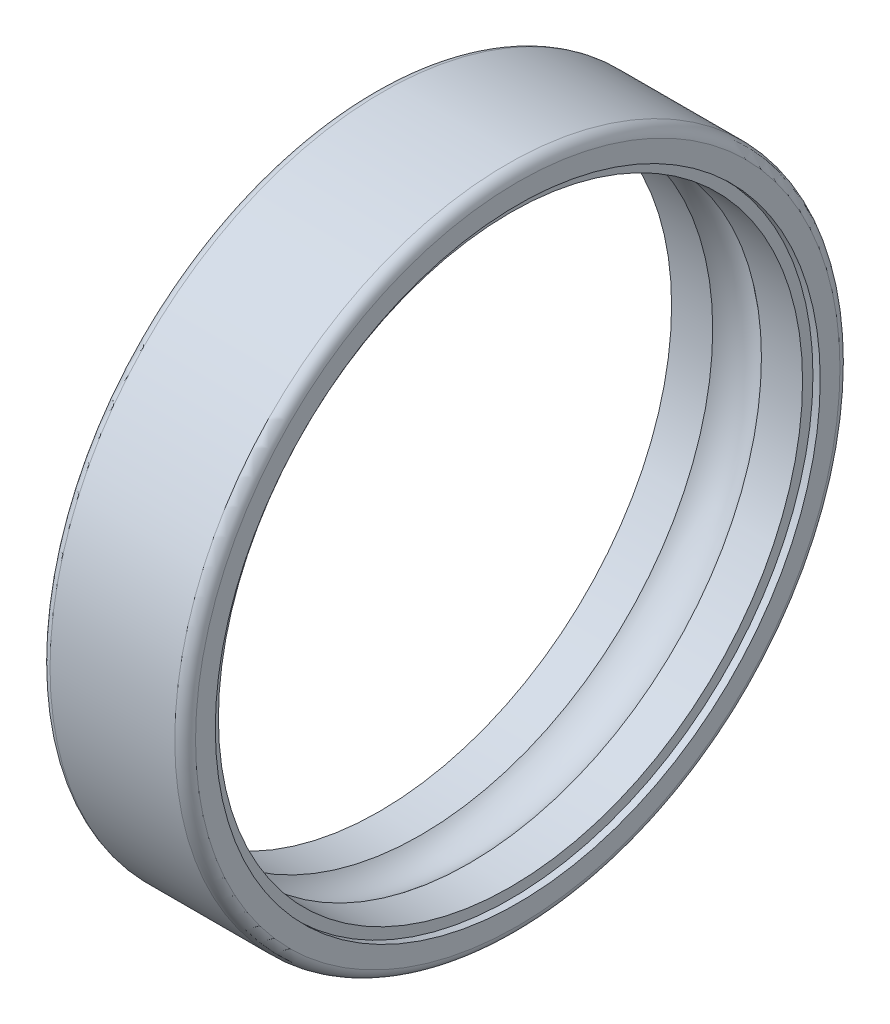
ISO-10303-21;
HEADER;
FILE_DESCRIPTION(('STEP AP214'),'2;1');
FILE_NAME('part.step','',(''),(''),'','','');
FILE_SCHEMA(('AUTOMOTIVE_DESIGN { 1 0 10303 214 1 1 1 1 }'));
ENDSEC;
DATA;
#1=APPLICATION_CONTEXT('core data for automotive mechanical design processes');
#2=APPLICATION_PROTOCOL_DEFINITION('international standard','automotive_design',2000,#1);
#3=PRODUCT_CONTEXT('',#1,'mechanical');
#4=PRODUCT('Part','Part','',(#3));
#5=PRODUCT_RELATED_PRODUCT_CATEGORY('part','',(#4));
#6=PRODUCT_DEFINITION_FORMATION('','',#4);
#7=PRODUCT_DEFINITION_CONTEXT('part definition',#1,'design');
#8=PRODUCT_DEFINITION('design','',#6,#7);
#9=PRODUCT_DEFINITION_SHAPE('','',#8);
#10=(LENGTH_UNIT() NAMED_UNIT(*) SI_UNIT(.MILLI.,.METRE.));
#11=(NAMED_UNIT(*) PLANE_ANGLE_UNIT() SI_UNIT($,.RADIAN.));
#12=(NAMED_UNIT(*) SI_UNIT($,.STERADIAN.) SOLID_ANGLE_UNIT());
#13=UNCERTAINTY_MEASURE_WITH_UNIT(LENGTH_MEASURE(1.E-05),#10,'distance_accuracy_value','');
#14=(GEOMETRIC_REPRESENTATION_CONTEXT(3) GLOBAL_UNCERTAINTY_ASSIGNED_CONTEXT((#13)) GLOBAL_UNIT_ASSIGNED_CONTEXT((#10,
#11,#12)) REPRESENTATION_CONTEXT('',''));
#15=CARTESIAN_POINT('',(0.,0.,0.));
#16=DIRECTION('',(0.,0.,1.));
#17=DIRECTION('',(1.,0.,0.));
#18=AXIS2_PLACEMENT_3D('',#15,#16,#17);
#19=CARTESIAN_POINT('',(0.592782730020049,0.,0.));
#20=DIRECTION('',(1.,0.,0.));
#21=DIRECTION('',(0.,0.,-1.));
#22=AXIS2_PLACEMENT_3D('',#19,#20,#21);
#23=TOROIDAL_SURFACE('',#22,15.4072172699799,0.6);
#24=CARTESIAN_POINT('',(0.500000000000006,0.,0.));
#25=DIRECTION('',(1.,0.,0.));
#26=DIRECTION('',(0.,0.,-1.));
#27=AXIS2_PLACEMENT_3D('',#24,#25,#26);
#28=CIRCLE('',#27,16.);
#29=CARTESIAN_POINT('',(0.500000000000006,0.,-16.));
#30=VERTEX_POINT('',#29);
#31=EDGE_CURVE('E10',#30,#30,#28,.T.);
#32=ORIENTED_EDGE('',*,*,#31,.F.);
#33=EDGE_LOOP('',(#32));
#34=FACE_BOUND('',#33,.T.);
#35=CARTESIAN_POINT('',(0.,0.,0.));
#36=DIRECTION('',(1.,0.,0.));
#37=DIRECTION('',(0.,0.,-1.));
#38=AXIS2_PLACEMENT_3D('',#35,#36,#37);
#39=CIRCLE('',#38,15.5);
#40=CARTESIAN_POINT('',(0.,0.,-15.5));
#41=VERTEX_POINT('',#40);
#42=EDGE_CURVE('E45',#41,#41,#39,.T.);
#43=ORIENTED_EDGE('',*,*,#42,.T.);
#44=EDGE_LOOP('',(#43));
#45=FACE_BOUND('',#44,.T.);
#46=ADVANCED_FACE('F14',(#34,#45),#23,.T.);
#47=CARTESIAN_POINT('',(7.,0.,0.));
#48=DIRECTION('',(1.,0.,0.));
#49=DIRECTION('',(0.,0.,-1.));
#50=AXIS2_PLACEMENT_3D('',#47,#48,#49);
#51=CYLINDRICAL_SURFACE('',#50,16.);
#52=CARTESIAN_POINT('',(6.5,0.,0.));
#53=DIRECTION('',(1.,0.,0.));
#54=DIRECTION('',(0.,0.,-1.));
#55=AXIS2_PLACEMENT_3D('',#52,#53,#54);
#56=CIRCLE('',#55,16.);
#57=CARTESIAN_POINT('',(6.5,0.,-16.));
#58=VERTEX_POINT('',#57);
#59=EDGE_CURVE('E21',#58,#58,#56,.T.);
#60=ORIENTED_EDGE('',*,*,#59,.F.);
#61=EDGE_LOOP('',(#60));
#62=FACE_BOUND('',#61,.T.);
#63=ORIENTED_EDGE('',*,*,#31,.T.);
#64=EDGE_LOOP('',(#63));
#65=FACE_BOUND('',#64,.T.);
#66=ADVANCED_FACE('F83',(#62,#65),#51,.T.);
#67=CARTESIAN_POINT('',(6.40721726997996,0.,0.));
#68=DIRECTION('',(1.,0.,0.));
#69=DIRECTION('',(0.,0.,-1.));
#70=AXIS2_PLACEMENT_3D('',#67,#68,#69);
#71=TOROIDAL_SURFACE('',#70,15.40721726998,0.599999999999991);
#72=CARTESIAN_POINT('',(7.,0.,0.));
#73=DIRECTION('',(1.,0.,0.));
#74=DIRECTION('',(0.,0.,-1.));
#75=AXIS2_PLACEMENT_3D('',#72,#73,#74);
#76=CIRCLE('',#75,15.5);
#77=CARTESIAN_POINT('',(7.,0.,-15.5));
#78=VERTEX_POINT('',#77);
#79=EDGE_CURVE('E28',#78,#78,#76,.T.);
#80=ORIENTED_EDGE('',*,*,#79,.F.);
#81=EDGE_LOOP('',(#80));
#82=FACE_BOUND('',#81,.T.);
#83=ORIENTED_EDGE('',*,*,#59,.T.);
#84=EDGE_LOOP('',(#83));
#85=FACE_BOUND('',#84,.T.);
#86=ADVANCED_FACE('F79',(#82,#85),#71,.T.);
#87=CARTESIAN_POINT('',(7.,14.55,0.));
#88=DIRECTION('',(1.,0.,0.));
#89=DIRECTION('',(0.,1.,0.));
#90=AXIS2_PLACEMENT_3D('',#87,#88,#89);
#91=PLANE('',#90);
#92=CARTESIAN_POINT('',(7.,0.,0.));
#93=DIRECTION('',(1.,0.,0.));
#94=DIRECTION('',(0.,0.,-1.));
#95=AXIS2_PLACEMENT_3D('',#92,#93,#94);
#96=CIRCLE('',#95,14.55);
#97=CARTESIAN_POINT('',(7.,0.,-14.55));
#98=VERTEX_POINT('',#97);
#99=EDGE_CURVE('E40',#98,#98,#96,.T.);
#100=ORIENTED_EDGE('',*,*,#99,.F.);
#101=EDGE_LOOP('',(#100));
#102=FACE_BOUND('',#101,.T.);
#103=ORIENTED_EDGE('',*,*,#79,.T.);
#104=EDGE_LOOP('',(#103));
#105=FACE_BOUND('',#104,.T.);
#106=ADVANCED_FACE('F80',(#102,#105),#91,.T.);
#107=CARTESIAN_POINT('',(7.,0.,0.));
#108=DIRECTION('',(1.,0.,0.));
#109=DIRECTION('',(0.,0.,-1.));
#110=AXIS2_PLACEMENT_3D('',#107,#108,#109);
#111=CYLINDRICAL_SURFACE('',#110,14.55);
#112=CARTESIAN_POINT('',(6.65,0.,0.));
#113=DIRECTION('',(1.,0.,0.));
#114=DIRECTION('',(0.,0.,-1.));
#115=AXIS2_PLACEMENT_3D('',#112,#113,#114);
#116=CIRCLE('',#115,14.55);
#117=CARTESIAN_POINT('',(6.65,0.,-14.55));
#118=VERTEX_POINT('',#117);
#119=EDGE_CURVE('E68',#118,#118,#116,.T.);
#120=ORIENTED_EDGE('',*,*,#119,.F.);
#121=EDGE_LOOP('',(#120));
#122=FACE_BOUND('',#121,.T.);
#123=ORIENTED_EDGE('',*,*,#99,.T.);
#124=EDGE_LOOP('',(#123));
#125=FACE_BOUND('',#124,.T.);
#126=ADVANCED_FACE('F74',(#122,#125),#111,.F.);
#127=CARTESIAN_POINT('',(6.65,14.05,0.));
#128=DIRECTION('',(1.,0.,0.));
#129=DIRECTION('',(0.,1.,0.));
#130=AXIS2_PLACEMENT_3D('',#127,#128,#129);
#131=PLANE('',#130);
#132=CARTESIAN_POINT('',(6.65,0.,0.));
#133=DIRECTION('',(1.,0.,0.));
#134=DIRECTION('',(0.,0.,-1.));
#135=AXIS2_PLACEMENT_3D('',#132,#133,#134);
#136=CIRCLE('',#135,14.05);
#137=CARTESIAN_POINT('',(6.65,0.,-14.05));
#138=VERTEX_POINT('',#137);
#139=EDGE_CURVE('E62',#138,#138,#136,.T.);
#140=ORIENTED_EDGE('',*,*,#139,.F.);
#141=EDGE_LOOP('',(#140));
#142=FACE_BOUND('',#141,.T.);
#143=ORIENTED_EDGE('',*,*,#119,.T.);
#144=EDGE_LOOP('',(#143));
#145=FACE_BOUND('',#144,.T.);
#146=ADVANCED_FACE('F135',(#142,#145),#131,.T.);
#147=CARTESIAN_POINT('',(7.,0.,0.));
#148=DIRECTION('',(1.,0.,0.));
#149=DIRECTION('',(0.,0.,-1.));
#150=AXIS2_PLACEMENT_3D('',#147,#148,#149);
#151=CYLINDRICAL_SURFACE('',#150,14.05);
#152=CARTESIAN_POINT('',(4.671537451386,0.,0.));
#153=DIRECTION('',(1.,0.,0.));
#154=DIRECTION('',(0.,0.,-1.));
#155=AXIS2_PLACEMENT_3D('',#152,#153,#154);
#156=CIRCLE('',#155,14.05);
#157=CARTESIAN_POINT('',(4.671537451386,0.,-14.05));
#158=VERTEX_POINT('',#157);
#159=EDGE_CURVE('E59',#158,#158,#156,.T.);
#160=ORIENTED_EDGE('',*,*,#159,.F.);
#161=EDGE_LOOP('',(#160));
#162=FACE_BOUND('',#161,.T.);
#163=ORIENTED_EDGE('',*,*,#139,.T.);
#164=EDGE_LOOP('',(#163));
#165=FACE_BOUND('',#164,.T.);
#166=ADVANCED_FACE('F130',(#162,#165),#151,.F.);
#167=CARTESIAN_POINT('',(3.5,0.,0.));
#168=DIRECTION('',(1.,0.,0.));
#169=DIRECTION('',(0.,0.,-1.));
#170=AXIS2_PLACEMENT_3D('',#167,#168,#169);
#171=TOROIDAL_SURFACE('',#170,12.75,1.75);
#172=ORIENTED_EDGE('',*,*,#159,.T.);
#173=EDGE_LOOP('',(#172));
#174=FACE_BOUND('',#173,.T.);
#175=CARTESIAN_POINT('',(2.328462548614,0.,0.));
#176=DIRECTION('',(1.,0.,0.));
#177=DIRECTION('',(0.,0.,-1.));
#178=AXIS2_PLACEMENT_3D('',#175,#176,#177);
#179=CIRCLE('',#178,14.05);
#180=CARTESIAN_POINT('',(2.328462548614,0.,-14.05));
#181=VERTEX_POINT('',#180);
#182=EDGE_CURVE('E50',#181,#181,#179,.T.);
#183=ORIENTED_EDGE('',*,*,#182,.F.);
#184=EDGE_LOOP('',(#183));
#185=FACE_BOUND('',#184,.T.);
#186=ADVANCED_FACE('F123',(#174,#185),#171,.F.);
#187=CARTESIAN_POINT('',(7.,0.,0.));
#188=DIRECTION('',(1.,0.,0.));
#189=DIRECTION('',(0.,0.,-1.));
#190=AXIS2_PLACEMENT_3D('',#187,#188,#189);
#191=CYLINDRICAL_SURFACE('',#190,14.05);
#192=CARTESIAN_POINT('',(0.35,0.,0.));
#193=DIRECTION('',(1.,0.,0.));
#194=DIRECTION('',(0.,0.,-1.));
#195=AXIS2_PLACEMENT_3D('',#192,#193,#194);
#196=CIRCLE('',#195,14.05);
#197=CARTESIAN_POINT('',(0.35,0.,-14.05));
#198=VERTEX_POINT('',#197);
#199=EDGE_CURVE('E43',#198,#198,#196,.T.);
#200=ORIENTED_EDGE('',*,*,#199,.F.);
#201=EDGE_LOOP('',(#200));
#202=FACE_BOUND('',#201,.T.);
#203=ORIENTED_EDGE('',*,*,#182,.T.);
#204=EDGE_LOOP('',(#203));
#205=FACE_BOUND('',#204,.T.);
#206=ADVANCED_FACE('F113',(#202,#205),#191,.F.);
#207=CARTESIAN_POINT('',(0.35,14.55,0.));
#208=DIRECTION('',(-1.,0.,0.));
#209=DIRECTION('',(0.,0.,1.));
#210=AXIS2_PLACEMENT_3D('',#207,#208,#209);
#211=PLANE('',#210);
#212=CARTESIAN_POINT('',(0.35,0.,0.));
#213=DIRECTION('',(1.,0.,0.));
#214=DIRECTION('',(0.,0.,-1.));
#215=AXIS2_PLACEMENT_3D('',#212,#213,#214);
#216=CIRCLE('',#215,14.55);
#217=CARTESIAN_POINT('',(0.35,0.,-14.55));
#218=VERTEX_POINT('',#217);
#219=EDGE_CURVE('E48',#218,#218,#216,.T.);
#220=ORIENTED_EDGE('',*,*,#219,.F.);
#221=EDGE_LOOP('',(#220));
#222=FACE_BOUND('',#221,.T.);
#223=ORIENTED_EDGE('',*,*,#199,.T.);
#224=EDGE_LOOP('',(#223));
#225=FACE_BOUND('',#224,.T.);
#226=ADVANCED_FACE('F108',(#222,#225),#211,.T.);
#227=CARTESIAN_POINT('',(7.,0.,0.));
#228=DIRECTION('',(1.,0.,0.));
#229=DIRECTION('',(0.,0.,-1.));
#230=AXIS2_PLACEMENT_3D('',#227,#228,#229);
#231=CYLINDRICAL_SURFACE('',#230,14.55);
#232=CARTESIAN_POINT('',(0.,0.,0.));
#233=DIRECTION('',(1.,0.,0.));
#234=DIRECTION('',(0.,0.,-1.));
#235=AXIS2_PLACEMENT_3D('',#232,#233,#234);
#236=CIRCLE('',#235,14.55);
#237=CARTESIAN_POINT('',(0.,0.,-14.55));
#238=VERTEX_POINT('',#237);
#239=EDGE_CURVE('E39',#238,#238,#236,.T.);
#240=ORIENTED_EDGE('',*,*,#239,.F.);
#241=EDGE_LOOP('',(#240));
#242=FACE_BOUND('',#241,.T.);
#243=ORIENTED_EDGE('',*,*,#219,.T.);
#244=EDGE_LOOP('',(#243));
#245=FACE_BOUND('',#244,.T.);
#246=ADVANCED_FACE('F103',(#242,#245),#231,.F.);
#247=CARTESIAN_POINT('',(0.,15.5,0.));
#248=DIRECTION('',(-1.,0.,0.));
#249=DIRECTION('',(0.,0.,1.));
#250=AXIS2_PLACEMENT_3D('',#247,#248,#249);
#251=PLANE('',#250);
#252=ORIENTED_EDGE('',*,*,#42,.F.);
#253=EDGE_LOOP('',(#252));
#254=FACE_BOUND('',#253,.T.);
#255=ORIENTED_EDGE('',*,*,#239,.T.);
#256=EDGE_LOOP('',(#255));
#257=FACE_BOUND('',#256,.T.);
#258=ADVANCED_FACE('F99',(#254,#257),#251,.T.);
#259=CLOSED_SHELL('',(#46,#66,#86,#106,#126,#146,#166,#186,#206,#226,#246,#258));
#260=MANIFOLD_SOLID_BREP('B1',#259);
#261=ADVANCED_BREP_SHAPE_REPRESENTATION('',(#18,#260),#14);
#262=SHAPE_DEFINITION_REPRESENTATION(#9,#261);
ENDSEC;
END-ISO-10303-21;
